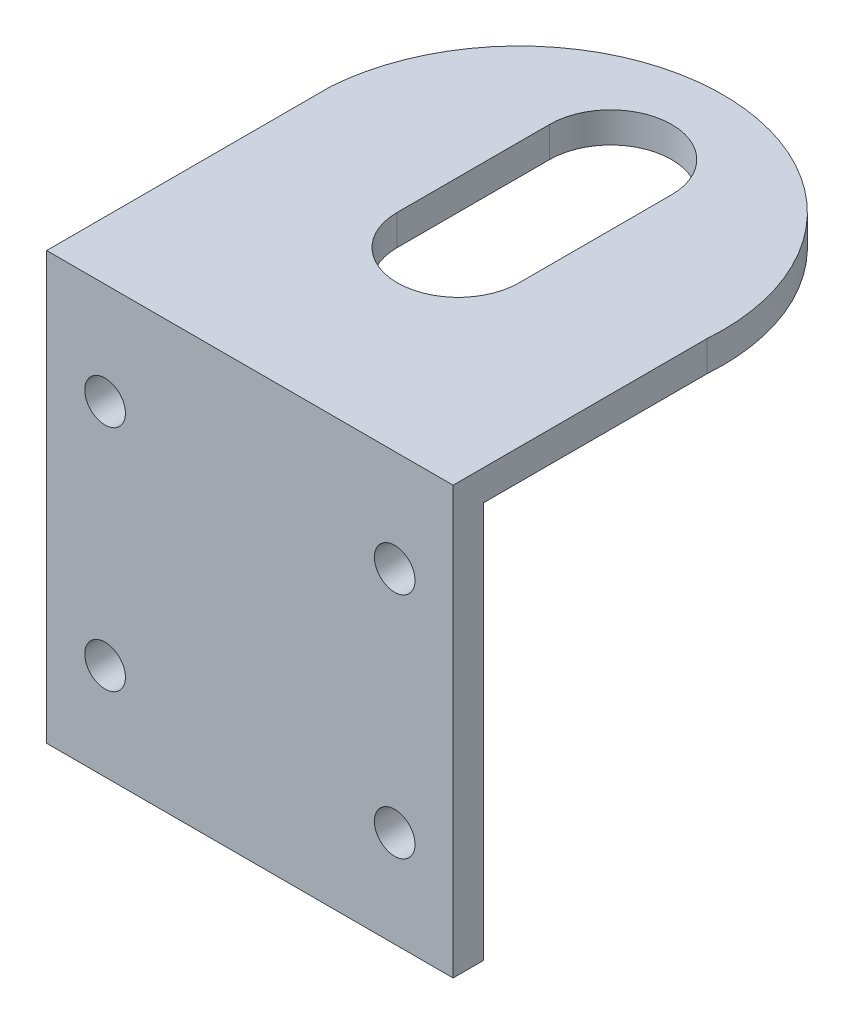
ISO-10303-21;
HEADER;
FILE_DESCRIPTION(('STEP AP214'),'2;1');
FILE_NAME('part.step','',(''),(''),'','','');
FILE_SCHEMA(('AUTOMOTIVE_DESIGN { 1 0 10303 214 1 1 1 1 }'));
ENDSEC;
DATA;
#1=APPLICATION_CONTEXT('core data for automotive mechanical design processes');
#2=APPLICATION_PROTOCOL_DEFINITION('international standard','automotive_design',2000,#1);
#3=PRODUCT_CONTEXT('',#1,'mechanical');
#4=PRODUCT('Part','Part','',(#3));
#5=PRODUCT_RELATED_PRODUCT_CATEGORY('part','',(#4));
#6=PRODUCT_DEFINITION_FORMATION('','',#4);
#7=PRODUCT_DEFINITION_CONTEXT('part definition',#1,'design');
#8=PRODUCT_DEFINITION('design','',#6,#7);
#9=PRODUCT_DEFINITION_SHAPE('','',#8);
#10=(LENGTH_UNIT() NAMED_UNIT(*) SI_UNIT(.MILLI.,.METRE.));
#11=(NAMED_UNIT(*) PLANE_ANGLE_UNIT() SI_UNIT($,.RADIAN.));
#12=(NAMED_UNIT(*) SI_UNIT($,.STERADIAN.) SOLID_ANGLE_UNIT());
#13=UNCERTAINTY_MEASURE_WITH_UNIT(LENGTH_MEASURE(1.E-05),#10,'distance_accuracy_value','');
#14=(GEOMETRIC_REPRESENTATION_CONTEXT(3) GLOBAL_UNCERTAINTY_ASSIGNED_CONTEXT((#13)) GLOBAL_UNIT_ASSIGNED_CONTEXT((#10,
#11,#12)) REPRESENTATION_CONTEXT('',''));
#15=CARTESIAN_POINT('',(0.,0.,0.));
#16=DIRECTION('',(0.,0.,1.));
#17=DIRECTION('',(1.,0.,0.));
#18=AXIS2_PLACEMENT_3D('',#15,#16,#17);
#19=CARTESIAN_POINT('',(20.,0.,-26.5));
#20=DIRECTION('',(0.,1.,0.));
#21=DIRECTION('',(0.,0.,1.));
#22=AXIS2_PLACEMENT_3D('',#19,#20,#21);
#23=PLANE('',#22);
#24=CARTESIAN_POINT('',(20.,0.,-35.5));
#25=DIRECTION('',(0.,1.,0.));
#26=DIRECTION('',(0.,0.,1.));
#27=AXIS2_PLACEMENT_3D('',#24,#25,#26);
#28=CIRCLE('',#27,6.00000000000001);
#29=CARTESIAN_POINT('',(26.,0.,-35.5));
#30=VERTEX_POINT('',#29);
#31=CARTESIAN_POINT('',(14.,0.,-35.5));
#32=VERTEX_POINT('',#31);
#33=EDGE_CURVE('E160',#30,#32,#28,.T.);
#34=ORIENTED_EDGE('',*,*,#33,.T.);
#35=DIRECTION('',(0.,0.,1.));
#36=VECTOR('',#35,1.);
#37=CARTESIAN_POINT('',(14.,0.,-35.5));
#38=LINE('',#37,#36);
#39=CARTESIAN_POINT('',(14.,0.,-20.5));
#40=VERTEX_POINT('',#39);
#41=EDGE_CURVE('E250',#32,#40,#38,.T.);
#42=ORIENTED_EDGE('',*,*,#41,.T.);
#43=CARTESIAN_POINT('',(20.,0.,-20.5));
#44=DIRECTION('',(0.,1.,0.));
#45=DIRECTION('',(0.,0.,1.));
#46=AXIS2_PLACEMENT_3D('',#43,#44,#45);
#47=CIRCLE('',#46,6.00000000000001);
#48=CARTESIAN_POINT('',(26.,0.,-20.5));
#49=VERTEX_POINT('',#48);
#50=EDGE_CURVE('E247',#40,#49,#47,.T.);
#51=ORIENTED_EDGE('',*,*,#50,.T.);
#52=DIRECTION('',(0.,0.,-1.));
#53=VECTOR('',#52,1.);
#54=CARTESIAN_POINT('',(26.,0.,-35.5));
#55=LINE('',#54,#53);
#56=EDGE_CURVE('E244',#49,#30,#55,.T.);
#57=ORIENTED_EDGE('',*,*,#56,.T.);
#58=EDGE_LOOP('',(#34,#42,#51,#57));
#59=FACE_BOUND('',#58,.T.);
#60=DIRECTION('',(1.,0.,0.));
#61=VECTOR('',#60,1.);
#62=CARTESIAN_POINT('',(40.,0.,-3.));
#63=LINE('',#62,#61);
#64=CARTESIAN_POINT('',(0.,0.,-3.));
#65=VERTEX_POINT('',#64);
#66=CARTESIAN_POINT('',(40.,0.,-3.));
#67=VERTEX_POINT('',#66);
#68=EDGE_CURVE('E50',#65,#67,#63,.T.);
#69=ORIENTED_EDGE('',*,*,#68,.F.);
#70=DIRECTION('',(0.,0.,1.));
#71=VECTOR('',#70,1.);
#72=CARTESIAN_POINT('',(0.,0.,0.));
#73=LINE('',#72,#71);
#74=CARTESIAN_POINT('',(0.,0.,-28.));
#75=VERTEX_POINT('',#74);
#76=EDGE_CURVE('E213',#75,#65,#73,.T.);
#77=ORIENTED_EDGE('',*,*,#76,.F.);
#78=CARTESIAN_POINT('',(20.,0.,-26.5));
#79=DIRECTION('',(0.,1.,0.));
#80=DIRECTION('',(0.,0.,1.));
#81=AXIS2_PLACEMENT_3D('',#78,#79,#80);
#82=CIRCLE('',#81,20.0561711201316);
#83=CARTESIAN_POINT('',(40.,0.,-25.));
#84=VERTEX_POINT('',#83);
#85=EDGE_CURVE('E212',#84,#75,#82,.T.);
#86=ORIENTED_EDGE('',*,*,#85,.F.);
#87=DIRECTION('',(0.,0.,-1.));
#88=VECTOR('',#87,1.);
#89=CARTESIAN_POINT('',(40.,0.,0.));
#90=LINE('',#89,#88);
#91=EDGE_CURVE('E151',#67,#84,#90,.T.);
#92=ORIENTED_EDGE('',*,*,#91,.F.);
#93=EDGE_LOOP('',(#69,#77,#86,#92));
#94=FACE_BOUND('',#93,.T.);
#95=ADVANCED_FACE('F33',(#59,#94),#23,.F.);
#96=CARTESIAN_POINT('',(20.,3.,-26.5));
#97=DIRECTION('',(0.,1.,0.));
#98=DIRECTION('',(0.,0.,1.));
#99=AXIS2_PLACEMENT_3D('',#96,#97,#98);
#100=PLANE('',#99);
#101=DIRECTION('',(0.,0.,1.));
#102=VECTOR('',#101,1.);
#103=CARTESIAN_POINT('',(0.,3.,0.));
#104=LINE('',#103,#102);
#105=CARTESIAN_POINT('',(0.,3.,-28.));
#106=VERTEX_POINT('',#105);
#107=CARTESIAN_POINT('',(0.,3.,0.));
#108=VERTEX_POINT('',#107);
#109=EDGE_CURVE('E221',#106,#108,#104,.T.);
#110=ORIENTED_EDGE('',*,*,#109,.T.);
#111=DIRECTION('',(1.,0.,0.));
#112=VECTOR('',#111,1.);
#113=CARTESIAN_POINT('',(0.,3.,0.));
#114=LINE('',#113,#112);
#115=CARTESIAN_POINT('',(40.,3.,0.));
#116=VERTEX_POINT('',#115);
#117=EDGE_CURVE('E224',#108,#116,#114,.T.);
#118=ORIENTED_EDGE('',*,*,#117,.T.);
#119=DIRECTION('',(0.,0.,-1.));
#120=VECTOR('',#119,1.);
#121=CARTESIAN_POINT('',(40.,3.,0.));
#122=LINE('',#121,#120);
#123=CARTESIAN_POINT('',(40.,3.,-25.));
#124=VERTEX_POINT('',#123);
#125=EDGE_CURVE('E119',#116,#124,#122,.T.);
#126=ORIENTED_EDGE('',*,*,#125,.T.);
#127=CARTESIAN_POINT('',(20.,3.,-26.5));
#128=DIRECTION('',(0.,1.,0.));
#129=DIRECTION('',(0.,0.,1.));
#130=AXIS2_PLACEMENT_3D('',#127,#128,#129);
#131=CIRCLE('',#130,20.0561711201316);
#132=EDGE_CURVE('E218',#124,#106,#131,.T.);
#133=ORIENTED_EDGE('',*,*,#132,.T.);
#134=EDGE_LOOP('',(#110,#118,#126,#133));
#135=FACE_BOUND('',#134,.T.);
#136=DIRECTION('',(0.,0.,1.));
#137=VECTOR('',#136,1.);
#138=CARTESIAN_POINT('',(14.,3.,-35.5));
#139=LINE('',#138,#137);
#140=CARTESIAN_POINT('',(14.,3.,-35.5));
#141=VERTEX_POINT('',#140);
#142=CARTESIAN_POINT('',(14.,3.,-20.5));
#143=VERTEX_POINT('',#142);
#144=EDGE_CURVE('E257',#141,#143,#139,.T.);
#145=ORIENTED_EDGE('',*,*,#144,.F.);
#146=CARTESIAN_POINT('',(20.,3.,-35.5));
#147=DIRECTION('',(0.,1.,0.));
#148=DIRECTION('',(0.,0.,1.));
#149=AXIS2_PLACEMENT_3D('',#146,#147,#148);
#150=CIRCLE('',#149,6.00000000000001);
#151=CARTESIAN_POINT('',(26.,3.,-35.5));
#152=VERTEX_POINT('',#151);
#153=EDGE_CURVE('E147',#152,#141,#150,.T.);
#154=ORIENTED_EDGE('',*,*,#153,.F.);
#155=DIRECTION('',(0.,0.,-1.));
#156=VECTOR('',#155,1.);
#157=CARTESIAN_POINT('',(26.,3.,-35.5));
#158=LINE('',#157,#156);
#159=CARTESIAN_POINT('',(26.,3.,-20.5));
#160=VERTEX_POINT('',#159);
#161=EDGE_CURVE('E243',#160,#152,#158,.T.);
#162=ORIENTED_EDGE('',*,*,#161,.F.);
#163=CARTESIAN_POINT('',(20.,3.,-20.5));
#164=DIRECTION('',(0.,1.,0.));
#165=DIRECTION('',(0.,0.,1.));
#166=AXIS2_PLACEMENT_3D('',#163,#164,#165);
#167=CIRCLE('',#166,6.00000000000001);
#168=EDGE_CURVE('E256',#143,#160,#167,.T.);
#169=ORIENTED_EDGE('',*,*,#168,.F.);
#170=EDGE_LOOP('',(#145,#154,#162,#169));
#171=FACE_BOUND('',#170,.T.);
#172=ADVANCED_FACE('F270',(#135,#171),#100,.T.);
#173=CARTESIAN_POINT('',(0.,3.,0.));
#174=DIRECTION('',(1.,0.,0.));
#175=DIRECTION('',(0.,0.,-1.));
#176=AXIS2_PLACEMENT_3D('',#173,#174,#175);
#177=PLANE('',#176);
#178=ORIENTED_EDGE('',*,*,#76,.T.);
#179=DIRECTION('',(0.,1.,0.));
#180=VECTOR('',#179,1.);
#181=CARTESIAN_POINT('',(0.,-39.,-3.));
#182=LINE('',#181,#180);
#183=CARTESIAN_POINT('',(0.,-39.,-3.));
#184=VERTEX_POINT('',#183);
#185=EDGE_CURVE('E155',#184,#65,#182,.T.);
#186=ORIENTED_EDGE('',*,*,#185,.F.);
#187=DIRECTION('',(0.,0.,-1.));
#188=VECTOR('',#187,1.);
#189=CARTESIAN_POINT('',(0.,-39.,0.));
#190=LINE('',#189,#188);
#191=CARTESIAN_POINT('',(0.,-39.,0.));
#192=VERTEX_POINT('',#191);
#193=EDGE_CURVE('E129',#192,#184,#190,.T.);
#194=ORIENTED_EDGE('',*,*,#193,.F.);
#195=DIRECTION('',(0.,-1.,0.));
#196=VECTOR('',#195,1.);
#197=CARTESIAN_POINT('',(0.,3.,0.));
#198=LINE('',#197,#196);
#199=EDGE_CURVE('E11',#108,#192,#198,.T.);
#200=ORIENTED_EDGE('',*,*,#199,.F.);
#201=ORIENTED_EDGE('',*,*,#109,.F.);
#202=DIRECTION('',(0.,-1.,0.));
#203=VECTOR('',#202,1.);
#204=CARTESIAN_POINT('',(0.,3.,-28.));
#205=LINE('',#204,#203);
#206=EDGE_CURVE('E219',#106,#75,#205,.T.);
#207=ORIENTED_EDGE('',*,*,#206,.T.);
#208=EDGE_LOOP('',(#178,#186,#194,#200,#201,#207));
#209=FACE_BOUND('',#208,.T.);
#210=ADVANCED_FACE('F35',(#209),#177,.F.);
#211=CARTESIAN_POINT('',(0.,3.,0.));
#212=DIRECTION('',(0.,0.,-1.));
#213=DIRECTION('',(-1.,0.,0.));
#214=AXIS2_PLACEMENT_3D('',#211,#212,#213);
#215=PLANE('',#214);
#216=CARTESIAN_POINT('',(34.2500000000002,-29.5,0.));
#217=DIRECTION('',(0.,0.,1.));
#218=DIRECTION('',(1.,0.,0.));
#219=AXIS2_PLACEMENT_3D('',#216,#217,#218);
#220=CIRCLE('',#219,2.);
#221=CARTESIAN_POINT('',(36.2500000000002,-29.5,0.));
#222=VERTEX_POINT('',#221);
#223=EDGE_CURVE('E179',#222,#222,#220,.T.);
#224=ORIENTED_EDGE('',*,*,#223,.F.);
#225=EDGE_LOOP('',(#224));
#226=FACE_BOUND('',#225,.T.);
#227=CARTESIAN_POINT('',(5.75000000000024,-29.5000000000002,0.));
#228=DIRECTION('',(0.,0.,1.));
#229=DIRECTION('',(1.,0.,0.));
#230=AXIS2_PLACEMENT_3D('',#227,#228,#229);
#231=CIRCLE('',#230,2.);
#232=CARTESIAN_POINT('',(7.75000000000024,-29.5000000000002,0.));
#233=VERTEX_POINT('',#232);
#234=EDGE_CURVE('E170',#233,#233,#231,.T.);
#235=ORIENTED_EDGE('',*,*,#234,.F.);
#236=EDGE_LOOP('',(#235));
#237=FACE_BOUND('',#236,.T.);
#238=CARTESIAN_POINT('',(5.75,-7.0000000000002,0.));
#239=DIRECTION('',(0.,0.,1.));
#240=DIRECTION('',(1.,0.,0.));
#241=AXIS2_PLACEMENT_3D('',#238,#239,#240);
#242=CIRCLE('',#241,2.);
#243=CARTESIAN_POINT('',(7.75000000000001,-7.0000000000002,0.));
#244=VERTEX_POINT('',#243);
#245=EDGE_CURVE('E167',#244,#244,#242,.T.);
#246=ORIENTED_EDGE('',*,*,#245,.F.);
#247=EDGE_LOOP('',(#246));
#248=FACE_BOUND('',#247,.T.);
#249=CARTESIAN_POINT('',(34.25,-7.,0.));
#250=DIRECTION('',(0.,0.,1.));
#251=DIRECTION('',(1.,0.,0.));
#252=AXIS2_PLACEMENT_3D('',#249,#250,#251);
#253=CIRCLE('',#252,2.);
#254=CARTESIAN_POINT('',(36.25,-7.,0.));
#255=VERTEX_POINT('',#254);
#256=EDGE_CURVE('E139',#255,#255,#253,.T.);
#257=ORIENTED_EDGE('',*,*,#256,.F.);
#258=EDGE_LOOP('',(#257));
#259=FACE_BOUND('',#258,.T.);
#260=ORIENTED_EDGE('',*,*,#199,.T.);
#261=DIRECTION('',(-1.,0.,0.));
#262=VECTOR('',#261,1.);
#263=CARTESIAN_POINT('',(40.,-39.,0.));
#264=LINE('',#263,#262);
#265=CARTESIAN_POINT('',(40.,-39.,0.));
#266=VERTEX_POINT('',#265);
#267=EDGE_CURVE('E124',#266,#192,#264,.T.);
#268=ORIENTED_EDGE('',*,*,#267,.F.);
#269=DIRECTION('',(0.,-1.,0.));
#270=VECTOR('',#269,1.);
#271=CARTESIAN_POINT('',(40.,3.,0.));
#272=LINE('',#271,#270);
#273=EDGE_CURVE('E42',#116,#266,#272,.T.);
#274=ORIENTED_EDGE('',*,*,#273,.F.);
#275=ORIENTED_EDGE('',*,*,#117,.F.);
#276=EDGE_LOOP('',(#260,#268,#274,#275));
#277=FACE_BOUND('',#276,.T.);
#278=ADVANCED_FACE('F125',(#226,#237,#248,#259,#277),#215,.F.);
#279=CARTESIAN_POINT('',(40.,3.,0.));
#280=DIRECTION('',(-1.,0.,0.));
#281=DIRECTION('',(0.,0.,1.));
#282=AXIS2_PLACEMENT_3D('',#279,#280,#281);
#283=PLANE('',#282);
#284=ORIENTED_EDGE('',*,*,#273,.T.);
#285=DIRECTION('',(0.,0.,1.));
#286=VECTOR('',#285,1.);
#287=CARTESIAN_POINT('',(40.,-39.,0.));
#288=LINE('',#287,#286);
#289=CARTESIAN_POINT('',(40.,-39.,-3.));
#290=VERTEX_POINT('',#289);
#291=EDGE_CURVE('E117',#290,#266,#288,.T.);
#292=ORIENTED_EDGE('',*,*,#291,.F.);
#293=DIRECTION('',(0.,1.,0.));
#294=VECTOR('',#293,1.);
#295=CARTESIAN_POINT('',(40.,-39.,-3.));
#296=LINE('',#295,#294);
#297=EDGE_CURVE('E144',#290,#67,#296,.T.);
#298=ORIENTED_EDGE('',*,*,#297,.T.);
#299=ORIENTED_EDGE('',*,*,#91,.T.);
#300=DIRECTION('',(0.,-1.,0.));
#301=VECTOR('',#300,1.);
#302=CARTESIAN_POINT('',(40.,3.,-25.));
#303=LINE('',#302,#301);
#304=EDGE_CURVE('E121',#124,#84,#303,.T.);
#305=ORIENTED_EDGE('',*,*,#304,.F.);
#306=ORIENTED_EDGE('',*,*,#125,.F.);
#307=EDGE_LOOP('',(#284,#292,#298,#299,#305,#306));
#308=FACE_BOUND('',#307,.T.);
#309=ADVANCED_FACE('F114',(#308),#283,.F.);
#310=CARTESIAN_POINT('',(20.,3.,-26.5));
#311=DIRECTION('',(0.,-1.,0.));
#312=DIRECTION('',(0.,0.,-1.));
#313=AXIS2_PLACEMENT_3D('',#310,#311,#312);
#314=CYLINDRICAL_SURFACE('',#313,20.0561711201316);
#315=ORIENTED_EDGE('',*,*,#85,.T.);
#316=ORIENTED_EDGE('',*,*,#206,.F.);
#317=ORIENTED_EDGE('',*,*,#132,.F.);
#318=ORIENTED_EDGE('',*,*,#304,.T.);
#319=EDGE_LOOP('',(#315,#316,#317,#318));
#320=FACE_BOUND('',#319,.T.);
#321=ADVANCED_FACE('F215',(#320),#314,.T.);
#322=CARTESIAN_POINT('',(20.,3.,-35.5));
#323=DIRECTION('',(0.,-1.,0.));
#324=DIRECTION('',(0.,0.,-1.));
#325=AXIS2_PLACEMENT_3D('',#322,#323,#324);
#326=CYLINDRICAL_SURFACE('',#325,6.00000000000001);
#327=ORIENTED_EDGE('',*,*,#33,.F.);
#328=DIRECTION('',(0.,-1.,0.));
#329=VECTOR('',#328,1.);
#330=CARTESIAN_POINT('',(26.,3.,-35.5));
#331=LINE('',#330,#329);
#332=EDGE_CURVE('E240',#152,#30,#331,.T.);
#333=ORIENTED_EDGE('',*,*,#332,.F.);
#334=ORIENTED_EDGE('',*,*,#153,.T.);
#335=DIRECTION('',(0.,-1.,0.));
#336=VECTOR('',#335,1.);
#337=CARTESIAN_POINT('',(14.,3.,-35.5));
#338=LINE('',#337,#336);
#339=EDGE_CURVE('E229',#141,#32,#338,.T.);
#340=ORIENTED_EDGE('',*,*,#339,.T.);
#341=EDGE_LOOP('',(#327,#333,#334,#340));
#342=FACE_BOUND('',#341,.T.);
#343=ADVANCED_FACE('F265',(#342),#326,.F.);
#344=CARTESIAN_POINT('',(14.,3.,-35.5));
#345=DIRECTION('',(1.,0.,0.));
#346=DIRECTION('',(0.,0.,-1.));
#347=AXIS2_PLACEMENT_3D('',#344,#345,#346);
#348=PLANE('',#347);
#349=ORIENTED_EDGE('',*,*,#41,.F.);
#350=ORIENTED_EDGE('',*,*,#339,.F.);
#351=ORIENTED_EDGE('',*,*,#144,.T.);
#352=DIRECTION('',(0.,-1.,0.));
#353=VECTOR('',#352,1.);
#354=CARTESIAN_POINT('',(14.,3.,-20.5));
#355=LINE('',#354,#353);
#356=EDGE_CURVE('E237',#143,#40,#355,.T.);
#357=ORIENTED_EDGE('',*,*,#356,.T.);
#358=EDGE_LOOP('',(#349,#350,#351,#357));
#359=FACE_BOUND('',#358,.T.);
#360=ADVANCED_FACE('F268',(#359),#348,.T.);
#361=CARTESIAN_POINT('',(20.,3.,-20.5));
#362=DIRECTION('',(0.,-1.,0.));
#363=DIRECTION('',(0.,0.,-1.));
#364=AXIS2_PLACEMENT_3D('',#361,#362,#363);
#365=CYLINDRICAL_SURFACE('',#364,6.00000000000001);
#366=ORIENTED_EDGE('',*,*,#50,.F.);
#367=ORIENTED_EDGE('',*,*,#356,.F.);
#368=ORIENTED_EDGE('',*,*,#168,.T.);
#369=DIRECTION('',(0.,-1.,0.));
#370=VECTOR('',#369,1.);
#371=CARTESIAN_POINT('',(26.,3.,-20.5));
#372=LINE('',#371,#370);
#373=EDGE_CURVE('E58',#160,#49,#372,.T.);
#374=ORIENTED_EDGE('',*,*,#373,.T.);
#375=EDGE_LOOP('',(#366,#367,#368,#374));
#376=FACE_BOUND('',#375,.T.);
#377=ADVANCED_FACE('F273',(#376),#365,.F.);
#378=CARTESIAN_POINT('',(26.,3.,-35.5));
#379=DIRECTION('',(-1.,0.,0.));
#380=DIRECTION('',(0.,0.,1.));
#381=AXIS2_PLACEMENT_3D('',#378,#379,#380);
#382=PLANE('',#381);
#383=ORIENTED_EDGE('',*,*,#56,.F.);
#384=ORIENTED_EDGE('',*,*,#373,.F.);
#385=ORIENTED_EDGE('',*,*,#161,.T.);
#386=ORIENTED_EDGE('',*,*,#332,.T.);
#387=EDGE_LOOP('',(#383,#384,#385,#386));
#388=FACE_BOUND('',#387,.T.);
#389=ADVANCED_FACE('F205',(#388),#382,.T.);
#390=CARTESIAN_POINT('',(40.,-39.,-3.));
#391=DIRECTION('',(0.,0.,1.));
#392=DIRECTION('',(1.,0.,0.));
#393=AXIS2_PLACEMENT_3D('',#390,#391,#392);
#394=PLANE('',#393);
#395=CARTESIAN_POINT('',(34.2500000000002,-29.5,-3.));
#396=DIRECTION('',(0.,0.,1.));
#397=DIRECTION('',(1.,0.,0.));
#398=AXIS2_PLACEMENT_3D('',#395,#396,#397);
#399=CIRCLE('',#398,2.);
#400=CARTESIAN_POINT('',(36.2500000000002,-29.5,-3.));
#401=VERTEX_POINT('',#400);
#402=EDGE_CURVE('E37',#401,#401,#399,.T.);
#403=ORIENTED_EDGE('',*,*,#402,.T.);
#404=EDGE_LOOP('',(#403));
#405=FACE_BOUND('',#404,.T.);
#406=CARTESIAN_POINT('',(5.75000000000024,-29.5000000000002,-3.));
#407=DIRECTION('',(0.,0.,1.));
#408=DIRECTION('',(1.,0.,0.));
#409=AXIS2_PLACEMENT_3D('',#406,#407,#408);
#410=CIRCLE('',#409,2.);
#411=CARTESIAN_POINT('',(7.75000000000024,-29.5000000000002,-3.));
#412=VERTEX_POINT('',#411);
#413=EDGE_CURVE('E168',#412,#412,#410,.T.);
#414=ORIENTED_EDGE('',*,*,#413,.T.);
#415=EDGE_LOOP('',(#414));
#416=FACE_BOUND('',#415,.T.);
#417=CARTESIAN_POINT('',(5.75,-7.0000000000002,-3.));
#418=DIRECTION('',(0.,0.,1.));
#419=DIRECTION('',(1.,0.,0.));
#420=AXIS2_PLACEMENT_3D('',#417,#418,#419);
#421=CIRCLE('',#420,2.);
#422=CARTESIAN_POINT('',(7.75000000000001,-7.0000000000002,-3.));
#423=VERTEX_POINT('',#422);
#424=EDGE_CURVE('E165',#423,#423,#421,.T.);
#425=ORIENTED_EDGE('',*,*,#424,.T.);
#426=EDGE_LOOP('',(#425));
#427=FACE_BOUND('',#426,.T.);
#428=CARTESIAN_POINT('',(34.25,-7.,-3.));
#429=DIRECTION('',(0.,0.,1.));
#430=DIRECTION('',(1.,0.,0.));
#431=AXIS2_PLACEMENT_3D('',#428,#429,#430);
#432=CIRCLE('',#431,2.);
#433=CARTESIAN_POINT('',(36.25,-7.,-3.));
#434=VERTEX_POINT('',#433);
#435=EDGE_CURVE('E136',#434,#434,#432,.T.);
#436=ORIENTED_EDGE('',*,*,#435,.T.);
#437=EDGE_LOOP('',(#436));
#438=FACE_BOUND('',#437,.T.);
#439=ORIENTED_EDGE('',*,*,#68,.T.);
#440=ORIENTED_EDGE('',*,*,#297,.F.);
#441=DIRECTION('',(1.,0.,0.));
#442=VECTOR('',#441,1.);
#443=CARTESIAN_POINT('',(40.,-39.,-3.));
#444=LINE('',#443,#442);
#445=EDGE_CURVE('E133',#184,#290,#444,.T.);
#446=ORIENTED_EDGE('',*,*,#445,.F.);
#447=ORIENTED_EDGE('',*,*,#185,.T.);
#448=EDGE_LOOP('',(#439,#440,#446,#447));
#449=FACE_BOUND('',#448,.T.);
#450=ADVANCED_FACE('F202',(#405,#416,#427,#438,#449),#394,.F.);
#451=CARTESIAN_POINT('',(0.,-39.,0.));
#452=DIRECTION('',(0.,1.,0.));
#453=DIRECTION('',(0.,0.,1.));
#454=AXIS2_PLACEMENT_3D('',#451,#452,#453);
#455=PLANE('',#454);
#456=ORIENTED_EDGE('',*,*,#291,.T.);
#457=ORIENTED_EDGE('',*,*,#267,.T.);
#458=ORIENTED_EDGE('',*,*,#193,.T.);
#459=ORIENTED_EDGE('',*,*,#445,.T.);
#460=EDGE_LOOP('',(#456,#457,#458,#459));
#461=FACE_BOUND('',#460,.T.);
#462=ADVANCED_FACE('F131',(#461),#455,.F.);
#463=CARTESIAN_POINT('',(34.25,-7.,-46.5561711201316));
#464=DIRECTION('',(0.,0.,1.));
#465=DIRECTION('',(1.,0.,0.));
#466=AXIS2_PLACEMENT_3D('',#463,#464,#465);
#467=CYLINDRICAL_SURFACE('',#466,2.);
#468=ORIENTED_EDGE('',*,*,#256,.T.);
#469=EDGE_LOOP('',(#468));
#470=FACE_BOUND('',#469,.T.);
#471=ORIENTED_EDGE('',*,*,#435,.F.);
#472=EDGE_LOOP('',(#471));
#473=FACE_BOUND('',#472,.T.);
#474=ADVANCED_FACE('F195',(#470,#473),#467,.F.);
#475=CARTESIAN_POINT('',(5.75,-7.0000000000002,-46.5561711201316));
#476=DIRECTION('',(0.,0.,1.));
#477=DIRECTION('',(1.,0.,0.));
#478=AXIS2_PLACEMENT_3D('',#475,#476,#477);
#479=CYLINDRICAL_SURFACE('',#478,2.);
#480=ORIENTED_EDGE('',*,*,#245,.T.);
#481=EDGE_LOOP('',(#480));
#482=FACE_BOUND('',#481,.T.);
#483=ORIENTED_EDGE('',*,*,#424,.F.);
#484=EDGE_LOOP('',(#483));
#485=FACE_BOUND('',#484,.T.);
#486=ADVANCED_FACE('F198',(#482,#485),#479,.F.);
#487=CARTESIAN_POINT('',(5.75000000000024,-29.5000000000002,-46.5561711201316));
#488=DIRECTION('',(0.,0.,1.));
#489=DIRECTION('',(1.,0.,0.));
#490=AXIS2_PLACEMENT_3D('',#487,#488,#489);
#491=CYLINDRICAL_SURFACE('',#490,2.);
#492=ORIENTED_EDGE('',*,*,#234,.T.);
#493=EDGE_LOOP('',(#492));
#494=FACE_BOUND('',#493,.T.);
#495=ORIENTED_EDGE('',*,*,#413,.F.);
#496=EDGE_LOOP('',(#495));
#497=FACE_BOUND('',#496,.T.);
#498=ADVANCED_FACE('F385',(#494,#497),#491,.F.);
#499=CARTESIAN_POINT('',(34.2500000000002,-29.5,-46.5561711201316));
#500=DIRECTION('',(0.,0.,1.));
#501=DIRECTION('',(1.,0.,0.));
#502=AXIS2_PLACEMENT_3D('',#499,#500,#501);
#503=CYLINDRICAL_SURFACE('',#502,2.);
#504=ORIENTED_EDGE('',*,*,#223,.T.);
#505=EDGE_LOOP('',(#504));
#506=FACE_BOUND('',#505,.T.);
#507=ORIENTED_EDGE('',*,*,#402,.F.);
#508=EDGE_LOOP('',(#507));
#509=FACE_BOUND('',#508,.T.);
#510=ADVANCED_FACE('F184',(#506,#509),#503,.F.);
#511=CLOSED_SHELL('',(#95,#172,#210,#278,#309,#321,#343,#360,#377,#389,#450,#462,#474,#486,#498,#510));
#512=MANIFOLD_SOLID_BREP('B2',#511);
#513=ADVANCED_BREP_SHAPE_REPRESENTATION('',(#18,#512),#14);
#514=SHAPE_DEFINITION_REPRESENTATION(#9,#513);
ENDSEC;
END-ISO-10303-21;
